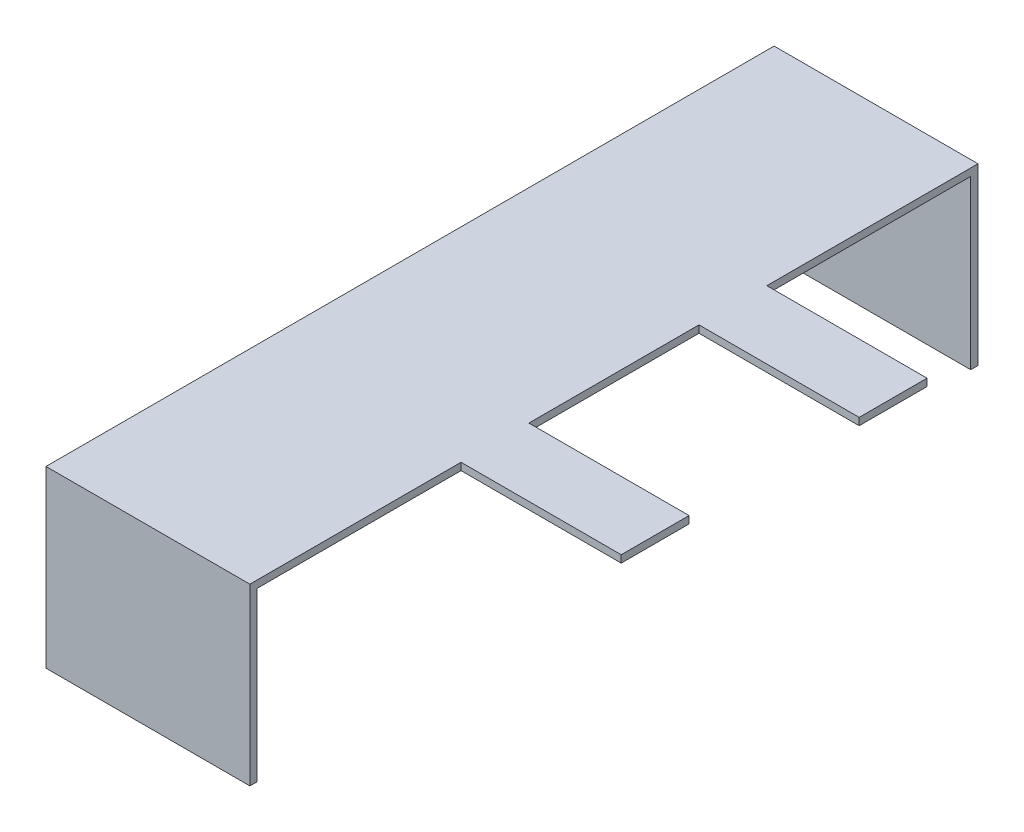
ISO-10303-21;
HEADER;
FILE_DESCRIPTION(('STEP AP214'),'2;1');
FILE_NAME('part.step','',(''),(''),'','','');
FILE_SCHEMA(('AUTOMOTIVE_DESIGN { 1 0 10303 214 1 1 1 1 }'));
ENDSEC;
DATA;
#1=APPLICATION_CONTEXT('core data for automotive mechanical design processes');
#2=APPLICATION_PROTOCOL_DEFINITION('international standard','automotive_design',2000,#1);
#3=PRODUCT_CONTEXT('',#1,'mechanical');
#4=PRODUCT('Part','Part','',(#3));
#5=PRODUCT_RELATED_PRODUCT_CATEGORY('part','',(#4));
#6=PRODUCT_DEFINITION_FORMATION('','',#4);
#7=PRODUCT_DEFINITION_CONTEXT('part definition',#1,'design');
#8=PRODUCT_DEFINITION('design','',#6,#7);
#9=PRODUCT_DEFINITION_SHAPE('','',#8);
#10=(LENGTH_UNIT() NAMED_UNIT(*) SI_UNIT(.MILLI.,.METRE.));
#11=(NAMED_UNIT(*) PLANE_ANGLE_UNIT() SI_UNIT($,.RADIAN.));
#12=(NAMED_UNIT(*) SI_UNIT($,.STERADIAN.) SOLID_ANGLE_UNIT());
#13=UNCERTAINTY_MEASURE_WITH_UNIT(LENGTH_MEASURE(1.E-05),#10,'distance_accuracy_value','');
#14=(GEOMETRIC_REPRESENTATION_CONTEXT(3) GLOBAL_UNCERTAINTY_ASSIGNED_CONTEXT((#13)) GLOBAL_UNIT_ASSIGNED_CONTEXT((#10,
#11,#12)) REPRESENTATION_CONTEXT('',''));
#15=CARTESIAN_POINT('',(0.,0.,0.));
#16=DIRECTION('',(0.,0.,1.));
#17=DIRECTION('',(1.,0.,0.));
#18=AXIS2_PLACEMENT_3D('',#15,#16,#17);
#19=CARTESIAN_POINT('',(0.,0.5,0.));
#20=DIRECTION('',(1.,0.,0.));
#21=DIRECTION('',(0.,0.,-1.));
#22=AXIS2_PLACEMENT_3D('',#19,#20,#21);
#23=PLANE('',#22);
#24=DIRECTION('',(0.,0.,1.));
#25=VECTOR('',#24,1.);
#26=CARTESIAN_POINT('',(0.,0.,0.));
#27=LINE('',#26,#25);
#28=CARTESIAN_POINT('',(0.,0.,-49.));
#29=VERTEX_POINT('',#28);
#30=CARTESIAN_POINT('',(0.,0.,0.));
#31=VERTEX_POINT('',#30);
#32=EDGE_CURVE('E152',#29,#31,#27,.T.);
#33=ORIENTED_EDGE('',*,*,#32,.T.);
#34=DIRECTION('',(0.,1.,0.));
#35=VECTOR('',#34,1.);
#36=CARTESIAN_POINT('',(0.,0.,0.));
#37=LINE('',#36,#35);
#38=CARTESIAN_POINT('',(0.,-11.5,0.));
#39=VERTEX_POINT('',#38);
#40=EDGE_CURVE('E228',#39,#31,#37,.T.);
#41=ORIENTED_EDGE('',*,*,#40,.F.);
#42=DIRECTION('',(0.,0.,-1.));
#43=VECTOR('',#42,1.);
#44=CARTESIAN_POINT('',(0.,-11.5,0.5));
#45=LINE('',#44,#43);
#46=CARTESIAN_POINT('',(0.,-11.5,0.5));
#47=VERTEX_POINT('',#46);
#48=EDGE_CURVE('E220',#47,#39,#45,.T.);
#49=ORIENTED_EDGE('',*,*,#48,.F.);
#50=DIRECTION('',(0.,-1.,0.));
#51=VECTOR('',#50,1.);
#52=CARTESIAN_POINT('',(0.,0.5,0.500000000000002));
#53=LINE('',#52,#51);
#54=CARTESIAN_POINT('',(0.,0.5,0.500000000000002));
#55=VERTEX_POINT('',#54);
#56=EDGE_CURVE('E238',#55,#47,#53,.T.);
#57=ORIENTED_EDGE('',*,*,#56,.F.);
#58=DIRECTION('',(0.,0.,1.));
#59=VECTOR('',#58,1.);
#60=CARTESIAN_POINT('',(0.,0.5,0.));
#61=LINE('',#60,#59);
#62=CARTESIAN_POINT('',(0.,0.5,-49.5));
#63=VERTEX_POINT('',#62);
#64=EDGE_CURVE('E177',#63,#55,#61,.T.);
#65=ORIENTED_EDGE('',*,*,#64,.F.);
#66=DIRECTION('',(0.,1.,0.));
#67=VECTOR('',#66,1.);
#68=CARTESIAN_POINT('',(0.,0.5,-49.5));
#69=LINE('',#68,#67);
#70=CARTESIAN_POINT('',(0.,-11.5,-49.5));
#71=VERTEX_POINT('',#70);
#72=EDGE_CURVE('E250',#71,#63,#69,.T.);
#73=ORIENTED_EDGE('',*,*,#72,.F.);
#74=DIRECTION('',(0.,0.,-1.));
#75=VECTOR('',#74,1.);
#76=CARTESIAN_POINT('',(0.,-11.5,-49.5));
#77=LINE('',#76,#75);
#78=CARTESIAN_POINT('',(0.,-11.5,-49.));
#79=VERTEX_POINT('',#78);
#80=EDGE_CURVE('E247',#79,#71,#77,.T.);
#81=ORIENTED_EDGE('',*,*,#80,.F.);
#82=DIRECTION('',(0.,-1.,0.));
#83=VECTOR('',#82,1.);
#84=CARTESIAN_POINT('',(0.,-11.5,-49.));
#85=LINE('',#84,#83);
#86=EDGE_CURVE('E243',#29,#79,#85,.T.);
#87=ORIENTED_EDGE('',*,*,#86,.F.);
#88=EDGE_LOOP('',(#33,#41,#49,#57,#65,#73,#81,#87));
#89=FACE_BOUND('',#88,.T.);
#90=ADVANCED_FACE('F39',(#89),#23,.F.);
#91=CARTESIAN_POINT('',(14.,0.5,-14.));
#92=DIRECTION('',(-1.,0.,0.));
#93=DIRECTION('',(0.,0.,1.));
#94=AXIS2_PLACEMENT_3D('',#91,#92,#93);
#95=PLANE('',#94);
#96=DIRECTION('',(0.,0.,-1.));
#97=VECTOR('',#96,1.);
#98=CARTESIAN_POINT('',(14.,0.,-14.));
#99=LINE('',#98,#97);
#100=CARTESIAN_POINT('',(14.,0.,0.));
#101=VERTEX_POINT('',#100);
#102=CARTESIAN_POINT('',(14.,0.,-14.));
#103=VERTEX_POINT('',#102);
#104=EDGE_CURVE('E159',#101,#103,#99,.T.);
#105=ORIENTED_EDGE('',*,*,#104,.T.);
#106=DIRECTION('',(0.,-1.,0.));
#107=VECTOR('',#106,1.);
#108=CARTESIAN_POINT('',(14.,0.5,-14.));
#109=LINE('',#108,#107);
#110=CARTESIAN_POINT('',(14.,0.5,-14.));
#111=VERTEX_POINT('',#110);
#112=EDGE_CURVE('E11',#111,#103,#109,.T.);
#113=ORIENTED_EDGE('',*,*,#112,.F.);
#114=DIRECTION('',(0.,0.,-1.));
#115=VECTOR('',#114,1.);
#116=CARTESIAN_POINT('',(14.,0.5,-14.));
#117=LINE('',#116,#115);
#118=CARTESIAN_POINT('',(14.,0.5,0.5));
#119=VERTEX_POINT('',#118);
#120=EDGE_CURVE('E105',#119,#111,#117,.T.);
#121=ORIENTED_EDGE('',*,*,#120,.F.);
#122=DIRECTION('',(0.,-1.,0.));
#123=VECTOR('',#122,1.);
#124=CARTESIAN_POINT('',(14.,0.5,0.5));
#125=LINE('',#124,#123);
#126=CARTESIAN_POINT('',(14.,-11.5,0.499999999999998));
#127=VERTEX_POINT('',#126);
#128=EDGE_CURVE('E232',#119,#127,#125,.T.);
#129=ORIENTED_EDGE('',*,*,#128,.T.);
#130=DIRECTION('',(0.,0.,-1.));
#131=VECTOR('',#130,1.);
#132=CARTESIAN_POINT('',(14.,-11.5,0.499999999999998));
#133=LINE('',#132,#131);
#134=CARTESIAN_POINT('',(14.,-11.5,0.));
#135=VERTEX_POINT('',#134);
#136=EDGE_CURVE('E229',#127,#135,#133,.T.);
#137=ORIENTED_EDGE('',*,*,#136,.T.);
#138=DIRECTION('',(0.,1.,0.));
#139=VECTOR('',#138,1.);
#140=CARTESIAN_POINT('',(14.,-11.5,0.));
#141=LINE('',#140,#139);
#142=EDGE_CURVE('E225',#135,#101,#141,.T.);
#143=ORIENTED_EDGE('',*,*,#142,.T.);
#144=EDGE_LOOP('',(#105,#113,#121,#129,#137,#143));
#145=FACE_BOUND('',#144,.T.);
#146=ADVANCED_FACE('F316',(#145),#95,.F.);
#147=CARTESIAN_POINT('',(14.,0.5,-14.));
#148=DIRECTION('',(0.,0.,-1.));
#149=DIRECTION('',(-1.,0.,0.));
#150=AXIS2_PLACEMENT_3D('',#147,#148,#149);
#151=PLANE('',#150);
#152=DIRECTION('',(1.,0.,0.));
#153=VECTOR('',#152,1.);
#154=CARTESIAN_POINT('',(14.,0.,-14.));
#155=LINE('',#154,#153);
#156=CARTESIAN_POINT('',(25.,0.,-14.));
#157=VERTEX_POINT('',#156);
#158=EDGE_CURVE('E161',#103,#157,#155,.T.);
#159=ORIENTED_EDGE('',*,*,#158,.T.);
#160=DIRECTION('',(0.,-1.,0.));
#161=VECTOR('',#160,1.);
#162=CARTESIAN_POINT('',(25.,0.5,-14.));
#163=LINE('',#162,#161);
#164=CARTESIAN_POINT('',(25.,0.5,-14.));
#165=VERTEX_POINT('',#164);
#166=EDGE_CURVE('E47',#165,#157,#163,.T.);
#167=ORIENTED_EDGE('',*,*,#166,.F.);
#168=DIRECTION('',(1.,0.,0.));
#169=VECTOR('',#168,1.);
#170=CARTESIAN_POINT('',(14.,0.5,-14.));
#171=LINE('',#170,#169);
#172=EDGE_CURVE('E213',#111,#165,#171,.T.);
#173=ORIENTED_EDGE('',*,*,#172,.F.);
#174=ORIENTED_EDGE('',*,*,#112,.T.);
#175=EDGE_LOOP('',(#159,#167,#173,#174));
#176=FACE_BOUND('',#175,.T.);
#177=ADVANCED_FACE('F339',(#176),#151,.F.);
#178=CARTESIAN_POINT('',(25.,0.5,-14.));
#179=DIRECTION('',(-1.,0.,0.));
#180=DIRECTION('',(0.,0.,1.));
#181=AXIS2_PLACEMENT_3D('',#178,#179,#180);
#182=PLANE('',#181);
#183=DIRECTION('',(0.,0.,-1.));
#184=VECTOR('',#183,1.);
#185=CARTESIAN_POINT('',(25.,0.,-14.));
#186=LINE('',#185,#184);
#187=CARTESIAN_POINT('',(25.,0.,-18.66));
#188=VERTEX_POINT('',#187);
#189=EDGE_CURVE('E163',#157,#188,#186,.T.);
#190=ORIENTED_EDGE('',*,*,#189,.T.);
#191=DIRECTION('',(0.,-1.,0.));
#192=VECTOR('',#191,1.);
#193=CARTESIAN_POINT('',(25.,0.5,-18.66));
#194=LINE('',#193,#192);
#195=CARTESIAN_POINT('',(25.,0.5,-18.66));
#196=VERTEX_POINT('',#195);
#197=EDGE_CURVE('E184',#196,#188,#194,.T.);
#198=ORIENTED_EDGE('',*,*,#197,.F.);
#199=DIRECTION('',(0.,0.,-1.));
#200=VECTOR('',#199,1.);
#201=CARTESIAN_POINT('',(25.,0.5,-14.));
#202=LINE('',#201,#200);
#203=EDGE_CURVE('E193',#165,#196,#202,.T.);
#204=ORIENTED_EDGE('',*,*,#203,.F.);
#205=ORIENTED_EDGE('',*,*,#166,.T.);
#206=EDGE_LOOP('',(#190,#198,#204,#205));
#207=FACE_BOUND('',#206,.T.);
#208=ADVANCED_FACE('F191',(#207),#182,.F.);
#209=CARTESIAN_POINT('',(25.,0.5,-18.66));
#210=DIRECTION('',(0.,0.,1.));
#211=DIRECTION('',(1.,0.,0.));
#212=AXIS2_PLACEMENT_3D('',#209,#210,#211);
#213=PLANE('',#212);
#214=DIRECTION('',(-1.,0.,0.));
#215=VECTOR('',#214,1.);
#216=CARTESIAN_POINT('',(25.,0.,-18.66));
#217=LINE('',#216,#215);
#218=CARTESIAN_POINT('',(14.,0.,-18.66));
#219=VERTEX_POINT('',#218);
#220=EDGE_CURVE('E165',#188,#219,#217,.T.);
#221=ORIENTED_EDGE('',*,*,#220,.T.);
#222=DIRECTION('',(0.,-1.,0.));
#223=VECTOR('',#222,1.);
#224=CARTESIAN_POINT('',(14.,0.5,-18.66));
#225=LINE('',#224,#223);
#226=CARTESIAN_POINT('',(14.,0.5,-18.66));
#227=VERTEX_POINT('',#226);
#228=EDGE_CURVE('E181',#227,#219,#225,.T.);
#229=ORIENTED_EDGE('',*,*,#228,.F.);
#230=DIRECTION('',(-1.,0.,0.));
#231=VECTOR('',#230,1.);
#232=CARTESIAN_POINT('',(25.,0.5,-18.66));
#233=LINE('',#232,#231);
#234=EDGE_CURVE('E209',#196,#227,#233,.T.);
#235=ORIENTED_EDGE('',*,*,#234,.F.);
#236=ORIENTED_EDGE('',*,*,#197,.T.);
#237=EDGE_LOOP('',(#221,#229,#235,#236));
#238=FACE_BOUND('',#237,.T.);
#239=ADVANCED_FACE('F205',(#238),#213,.F.);
#240=CARTESIAN_POINT('',(14.,0.5,-30.34));
#241=DIRECTION('',(-1.,0.,0.));
#242=DIRECTION('',(0.,0.,1.));
#243=AXIS2_PLACEMENT_3D('',#240,#241,#242);
#244=PLANE('',#243);
#245=DIRECTION('',(0.,0.,-1.));
#246=VECTOR('',#245,1.);
#247=CARTESIAN_POINT('',(14.,0.,-30.34));
#248=LINE('',#247,#246);
#249=CARTESIAN_POINT('',(14.,0.,-30.34));
#250=VERTEX_POINT('',#249);
#251=EDGE_CURVE('E167',#219,#250,#248,.T.);
#252=ORIENTED_EDGE('',*,*,#251,.T.);
#253=DIRECTION('',(0.,-1.,0.));
#254=VECTOR('',#253,1.);
#255=CARTESIAN_POINT('',(14.,0.5,-30.34));
#256=LINE('',#255,#254);
#257=CARTESIAN_POINT('',(14.,0.5,-30.34));
#258=VERTEX_POINT('',#257);
#259=EDGE_CURVE('E141',#258,#250,#256,.T.);
#260=ORIENTED_EDGE('',*,*,#259,.F.);
#261=DIRECTION('',(0.,0.,-1.));
#262=VECTOR('',#261,1.);
#263=CARTESIAN_POINT('',(14.,0.5,-30.34));
#264=LINE('',#263,#262);
#265=EDGE_CURVE('E129',#227,#258,#264,.T.);
#266=ORIENTED_EDGE('',*,*,#265,.F.);
#267=ORIENTED_EDGE('',*,*,#228,.T.);
#268=EDGE_LOOP('',(#252,#260,#266,#267));
#269=FACE_BOUND('',#268,.T.);
#270=ADVANCED_FACE('F208',(#269),#244,.F.);
#271=CARTESIAN_POINT('',(14.,0.5,-30.34));
#272=DIRECTION('',(0.,0.,-1.));
#273=DIRECTION('',(-1.,0.,0.));
#274=AXIS2_PLACEMENT_3D('',#271,#272,#273);
#275=PLANE('',#274);
#276=DIRECTION('',(1.,0.,0.));
#277=VECTOR('',#276,1.);
#278=CARTESIAN_POINT('',(14.,0.,-30.34));
#279=LINE('',#278,#277);
#280=CARTESIAN_POINT('',(25.,0.,-30.34));
#281=VERTEX_POINT('',#280);
#282=EDGE_CURVE('E138',#250,#281,#279,.T.);
#283=ORIENTED_EDGE('',*,*,#282,.T.);
#284=DIRECTION('',(0.,-1.,0.));
#285=VECTOR('',#284,1.);
#286=CARTESIAN_POINT('',(25.,0.5,-30.34));
#287=LINE('',#286,#285);
#288=CARTESIAN_POINT('',(25.,0.5,-30.34));
#289=VERTEX_POINT('',#288);
#290=EDGE_CURVE('E135',#289,#281,#287,.T.);
#291=ORIENTED_EDGE('',*,*,#290,.F.);
#292=DIRECTION('',(1.,0.,0.));
#293=VECTOR('',#292,1.);
#294=CARTESIAN_POINT('',(14.,0.5,-30.34));
#295=LINE('',#294,#293);
#296=EDGE_CURVE('E121',#258,#289,#295,.T.);
#297=ORIENTED_EDGE('',*,*,#296,.F.);
#298=ORIENTED_EDGE('',*,*,#259,.T.);
#299=EDGE_LOOP('',(#283,#291,#297,#298));
#300=FACE_BOUND('',#299,.T.);
#301=ADVANCED_FACE('F136',(#300),#275,.F.);
#302=CARTESIAN_POINT('',(25.,0.5,-35.));
#303=DIRECTION('',(-1.,0.,0.));
#304=DIRECTION('',(0.,0.,1.));
#305=AXIS2_PLACEMENT_3D('',#302,#303,#304);
#306=PLANE('',#305);
#307=DIRECTION('',(0.,0.,-1.));
#308=VECTOR('',#307,1.);
#309=CARTESIAN_POINT('',(25.,0.,-35.));
#310=LINE('',#309,#308);
#311=CARTESIAN_POINT('',(25.,0.,-35.));
#312=VERTEX_POINT('',#311);
#313=EDGE_CURVE('E170',#281,#312,#310,.T.);
#314=ORIENTED_EDGE('',*,*,#313,.T.);
#315=DIRECTION('',(0.,-1.,0.));
#316=VECTOR('',#315,1.);
#317=CARTESIAN_POINT('',(25.,0.5,-35.));
#318=LINE('',#317,#316);
#319=CARTESIAN_POINT('',(25.,0.5,-35.));
#320=VERTEX_POINT('',#319);
#321=EDGE_CURVE('E142',#320,#312,#318,.T.);
#322=ORIENTED_EDGE('',*,*,#321,.F.);
#323=DIRECTION('',(0.,0.,-1.));
#324=VECTOR('',#323,1.);
#325=CARTESIAN_POINT('',(25.,0.5,-35.));
#326=LINE('',#325,#324);
#327=EDGE_CURVE('E126',#289,#320,#326,.T.);
#328=ORIENTED_EDGE('',*,*,#327,.F.);
#329=ORIENTED_EDGE('',*,*,#290,.T.);
#330=EDGE_LOOP('',(#314,#322,#328,#329));
#331=FACE_BOUND('',#330,.T.);
#332=ADVANCED_FACE('F144',(#331),#306,.F.);
#333=CARTESIAN_POINT('',(25.,0.5,-35.));
#334=DIRECTION('',(0.,0.,1.));
#335=DIRECTION('',(1.,0.,0.));
#336=AXIS2_PLACEMENT_3D('',#333,#334,#335);
#337=PLANE('',#336);
#338=DIRECTION('',(-1.,0.,0.));
#339=VECTOR('',#338,1.);
#340=CARTESIAN_POINT('',(25.,0.,-35.));
#341=LINE('',#340,#339);
#342=CARTESIAN_POINT('',(14.,0.,-35.));
#343=VERTEX_POINT('',#342);
#344=EDGE_CURVE('E90',#312,#343,#341,.T.);
#345=ORIENTED_EDGE('',*,*,#344,.T.);
#346=DIRECTION('',(0.,-1.,0.));
#347=VECTOR('',#346,1.);
#348=CARTESIAN_POINT('',(14.,0.5,-35.));
#349=LINE('',#348,#347);
#350=CARTESIAN_POINT('',(14.,0.5,-35.));
#351=VERTEX_POINT('',#350);
#352=EDGE_CURVE('E151',#351,#343,#349,.T.);
#353=ORIENTED_EDGE('',*,*,#352,.F.);
#354=DIRECTION('',(-1.,0.,0.));
#355=VECTOR('',#354,1.);
#356=CARTESIAN_POINT('',(25.,0.5,-35.));
#357=LINE('',#356,#355);
#358=EDGE_CURVE('E55',#320,#351,#357,.T.);
#359=ORIENTED_EDGE('',*,*,#358,.F.);
#360=ORIENTED_EDGE('',*,*,#321,.T.);
#361=EDGE_LOOP('',(#345,#353,#359,#360));
#362=FACE_BOUND('',#361,.T.);
#363=ADVANCED_FACE('F326',(#362),#337,.F.);
#364=CARTESIAN_POINT('',(14.,0.5,-35.));
#365=DIRECTION('',(-1.,0.,0.));
#366=DIRECTION('',(0.,0.,1.));
#367=AXIS2_PLACEMENT_3D('',#364,#365,#366);
#368=PLANE('',#367);
#369=DIRECTION('',(0.,0.,-1.));
#370=VECTOR('',#369,1.);
#371=CARTESIAN_POINT('',(14.,0.,-35.));
#372=LINE('',#371,#370);
#373=CARTESIAN_POINT('',(14.,0.,-49.));
#374=VERTEX_POINT('',#373);
#375=EDGE_CURVE('E97',#343,#374,#372,.T.);
#376=ORIENTED_EDGE('',*,*,#375,.T.);
#377=DIRECTION('',(0.,-1.,0.));
#378=VECTOR('',#377,1.);
#379=CARTESIAN_POINT('',(14.,0.,-49.));
#380=LINE('',#379,#378);
#381=CARTESIAN_POINT('',(14.,-11.5,-49.));
#382=VERTEX_POINT('',#381);
#383=EDGE_CURVE('E246',#374,#382,#380,.T.);
#384=ORIENTED_EDGE('',*,*,#383,.T.);
#385=DIRECTION('',(0.,0.,-1.));
#386=VECTOR('',#385,1.);
#387=CARTESIAN_POINT('',(14.,-11.5,-49.5));
#388=LINE('',#387,#386);
#389=CARTESIAN_POINT('',(14.,-11.5,-49.5));
#390=VERTEX_POINT('',#389);
#391=EDGE_CURVE('E235',#382,#390,#388,.T.);
#392=ORIENTED_EDGE('',*,*,#391,.T.);
#393=DIRECTION('',(0.,1.,0.));
#394=VECTOR('',#393,1.);
#395=CARTESIAN_POINT('',(14.,0.5,-49.5));
#396=LINE('',#395,#394);
#397=CARTESIAN_POINT('',(14.,0.5,-49.5));
#398=VERTEX_POINT('',#397);
#399=EDGE_CURVE('E256',#390,#398,#396,.T.);
#400=ORIENTED_EDGE('',*,*,#399,.T.);
#401=DIRECTION('',(0.,0.,-1.));
#402=VECTOR('',#401,1.);
#403=CARTESIAN_POINT('',(14.,0.5,-35.));
#404=LINE('',#403,#402);
#405=EDGE_CURVE('E146',#351,#398,#404,.T.);
#406=ORIENTED_EDGE('',*,*,#405,.F.);
#407=ORIENTED_EDGE('',*,*,#352,.T.);
#408=EDGE_LOOP('',(#376,#384,#392,#400,#406,#407));
#409=FACE_BOUND('',#408,.T.);
#410=ADVANCED_FACE('F283',(#409),#368,.F.);
#411=CARTESIAN_POINT('',(0.,0.5,0.));
#412=DIRECTION('',(0.,-1.,0.));
#413=DIRECTION('',(0.,0.,-1.));
#414=AXIS2_PLACEMENT_3D('',#411,#412,#413);
#415=PLANE('',#414);
#416=ORIENTED_EDGE('',*,*,#64,.T.);
#417=DIRECTION('',(1.,0.,0.));
#418=VECTOR('',#417,1.);
#419=CARTESIAN_POINT('',(0.,0.5,0.500000000000002));
#420=LINE('',#419,#418);
#421=EDGE_CURVE('E217',#55,#119,#420,.T.);
#422=ORIENTED_EDGE('',*,*,#421,.T.);
#423=ORIENTED_EDGE('',*,*,#120,.T.);
#424=ORIENTED_EDGE('',*,*,#172,.T.);
#425=ORIENTED_EDGE('',*,*,#203,.T.);
#426=ORIENTED_EDGE('',*,*,#234,.T.);
#427=ORIENTED_EDGE('',*,*,#265,.T.);
#428=ORIENTED_EDGE('',*,*,#296,.T.);
#429=ORIENTED_EDGE('',*,*,#327,.T.);
#430=ORIENTED_EDGE('',*,*,#358,.T.);
#431=ORIENTED_EDGE('',*,*,#405,.T.);
#432=DIRECTION('',(1.,0.,0.));
#433=VECTOR('',#432,1.);
#434=CARTESIAN_POINT('',(0.,0.5,-49.5));
#435=LINE('',#434,#433);
#436=EDGE_CURVE('E260',#63,#398,#435,.T.);
#437=ORIENTED_EDGE('',*,*,#436,.F.);
#438=EDGE_LOOP('',(#416,#422,#423,#424,#425,#426,#427,#428,#429,#430,#431,#437));
#439=FACE_BOUND('',#438,.T.);
#440=ADVANCED_FACE('F124',(#439),#415,.F.);
#441=CARTESIAN_POINT('',(0.,0.,0.));
#442=DIRECTION('',(0.,-1.,0.));
#443=DIRECTION('',(0.,0.,-1.));
#444=AXIS2_PLACEMENT_3D('',#441,#442,#443);
#445=PLANE('',#444);
#446=ORIENTED_EDGE('',*,*,#32,.F.);
#447=DIRECTION('',(-1.,0.,0.));
#448=VECTOR('',#447,1.);
#449=CARTESIAN_POINT('',(0.,0.,-49.));
#450=LINE('',#449,#448);
#451=EDGE_CURVE('E174',#374,#29,#450,.T.);
#452=ORIENTED_EDGE('',*,*,#451,.F.);
#453=ORIENTED_EDGE('',*,*,#375,.F.);
#454=ORIENTED_EDGE('',*,*,#344,.F.);
#455=ORIENTED_EDGE('',*,*,#313,.F.);
#456=ORIENTED_EDGE('',*,*,#282,.F.);
#457=ORIENTED_EDGE('',*,*,#251,.F.);
#458=ORIENTED_EDGE('',*,*,#220,.F.);
#459=ORIENTED_EDGE('',*,*,#189,.F.);
#460=ORIENTED_EDGE('',*,*,#158,.F.);
#461=ORIENTED_EDGE('',*,*,#104,.F.);
#462=DIRECTION('',(1.,0.,0.));
#463=VECTOR('',#462,1.);
#464=CARTESIAN_POINT('',(0.,0.,0.));
#465=LINE('',#464,#463);
#466=EDGE_CURVE('E155',#31,#101,#465,.T.);
#467=ORIENTED_EDGE('',*,*,#466,.F.);
#468=EDGE_LOOP('',(#446,#452,#453,#454,#455,#456,#457,#458,#459,#460,#461,#467));
#469=FACE_BOUND('',#468,.T.);
#470=ADVANCED_FACE('F200',(#469),#445,.T.);
#471=CARTESIAN_POINT('',(0.,-11.5,0.));
#472=DIRECTION('',(0.,0.,-1.));
#473=DIRECTION('',(-1.,0.,0.));
#474=AXIS2_PLACEMENT_3D('',#471,#472,#473);
#475=PLANE('',#474);
#476=ORIENTED_EDGE('',*,*,#40,.T.);
#477=ORIENTED_EDGE('',*,*,#466,.T.);
#478=ORIENTED_EDGE('',*,*,#142,.F.);
#479=DIRECTION('',(1.,0.,0.));
#480=VECTOR('',#479,1.);
#481=CARTESIAN_POINT('',(0.,-11.5,0.));
#482=LINE('',#481,#480);
#483=EDGE_CURVE('E156',#39,#135,#482,.T.);
#484=ORIENTED_EDGE('',*,*,#483,.F.);
#485=EDGE_LOOP('',(#476,#477,#478,#484));
#486=FACE_BOUND('',#485,.T.);
#487=ADVANCED_FACE('F318',(#486),#475,.T.);
#488=CARTESIAN_POINT('',(0.,-11.5,0.5));
#489=DIRECTION('',(0.,-1.,0.));
#490=DIRECTION('',(0.,0.,-1.));
#491=AXIS2_PLACEMENT_3D('',#488,#489,#490);
#492=PLANE('',#491);
#493=ORIENTED_EDGE('',*,*,#136,.F.);
#494=DIRECTION('',(1.,0.,0.));
#495=VECTOR('',#494,1.);
#496=CARTESIAN_POINT('',(0.,-11.5,0.5));
#497=LINE('',#496,#495);
#498=EDGE_CURVE('E219',#47,#127,#497,.T.);
#499=ORIENTED_EDGE('',*,*,#498,.F.);
#500=ORIENTED_EDGE('',*,*,#48,.T.);
#501=ORIENTED_EDGE('',*,*,#483,.T.);
#502=EDGE_LOOP('',(#493,#499,#500,#501));
#503=FACE_BOUND('',#502,.T.);
#504=ADVANCED_FACE('F311',(#503),#492,.T.);
#505=CARTESIAN_POINT('',(0.,0.5,0.500000000000002));
#506=DIRECTION('',(0.,0.,1.));
#507=DIRECTION('',(0.,-1.,0.));
#508=AXIS2_PLACEMENT_3D('',#505,#506,#507);
#509=PLANE('',#508);
#510=ORIENTED_EDGE('',*,*,#128,.F.);
#511=ORIENTED_EDGE('',*,*,#421,.F.);
#512=ORIENTED_EDGE('',*,*,#56,.T.);
#513=ORIENTED_EDGE('',*,*,#498,.T.);
#514=EDGE_LOOP('',(#510,#511,#512,#513));
#515=FACE_BOUND('',#514,.T.);
#516=ADVANCED_FACE('F420',(#515),#509,.T.);
#517=CARTESIAN_POINT('',(0.,0.,-49.));
#518=DIRECTION('',(0.,0.,1.));
#519=DIRECTION('',(0.,-1.,0.));
#520=AXIS2_PLACEMENT_3D('',#517,#518,#519);
#521=PLANE('',#520);
#522=ORIENTED_EDGE('',*,*,#383,.F.);
#523=ORIENTED_EDGE('',*,*,#451,.T.);
#524=ORIENTED_EDGE('',*,*,#86,.T.);
#525=DIRECTION('',(1.,0.,0.));
#526=VECTOR('',#525,1.);
#527=CARTESIAN_POINT('',(0.,-11.5,-49.));
#528=LINE('',#527,#526);
#529=EDGE_CURVE('E253',#79,#382,#528,.T.);
#530=ORIENTED_EDGE('',*,*,#529,.T.);
#531=EDGE_LOOP('',(#522,#523,#524,#530));
#532=FACE_BOUND('',#531,.T.);
#533=ADVANCED_FACE('F272',(#532),#521,.T.);
#534=CARTESIAN_POINT('',(0.,0.5,-49.5));
#535=DIRECTION('',(0.,0.,-1.));
#536=DIRECTION('',(-1.,0.,0.));
#537=AXIS2_PLACEMENT_3D('',#534,#535,#536);
#538=PLANE('',#537);
#539=ORIENTED_EDGE('',*,*,#399,.F.);
#540=DIRECTION('',(1.,0.,0.));
#541=VECTOR('',#540,1.);
#542=CARTESIAN_POINT('',(0.,-11.5,-49.5));
#543=LINE('',#542,#541);
#544=EDGE_CURVE('E263',#71,#390,#543,.T.);
#545=ORIENTED_EDGE('',*,*,#544,.F.);
#546=ORIENTED_EDGE('',*,*,#72,.T.);
#547=ORIENTED_EDGE('',*,*,#436,.T.);
#548=EDGE_LOOP('',(#539,#545,#546,#547));
#549=FACE_BOUND('',#548,.T.);
#550=ADVANCED_FACE('F324',(#549),#538,.T.);
#551=CARTESIAN_POINT('',(0.,-11.5,-49.5));
#552=DIRECTION('',(0.,-1.,0.));
#553=DIRECTION('',(0.,0.,-1.));
#554=AXIS2_PLACEMENT_3D('',#551,#552,#553);
#555=PLANE('',#554);
#556=ORIENTED_EDGE('',*,*,#391,.F.);
#557=ORIENTED_EDGE('',*,*,#529,.F.);
#558=ORIENTED_EDGE('',*,*,#80,.T.);
#559=ORIENTED_EDGE('',*,*,#544,.T.);
#560=EDGE_LOOP('',(#556,#557,#558,#559));
#561=FACE_BOUND('',#560,.T.);
#562=ADVANCED_FACE('F280',(#561),#555,.T.);
#563=CLOSED_SHELL('',(#90,#146,#177,#208,#239,#270,#301,#332,#363,#410,#440,#470,#487,#504,#516,
#533,#550,#562));
#564=MANIFOLD_SOLID_BREP('B2',#563);
#565=ADVANCED_BREP_SHAPE_REPRESENTATION('',(#18,#564),#14);
#566=SHAPE_DEFINITION_REPRESENTATION(#9,#565);
ENDSEC;
END-ISO-10303-21;
